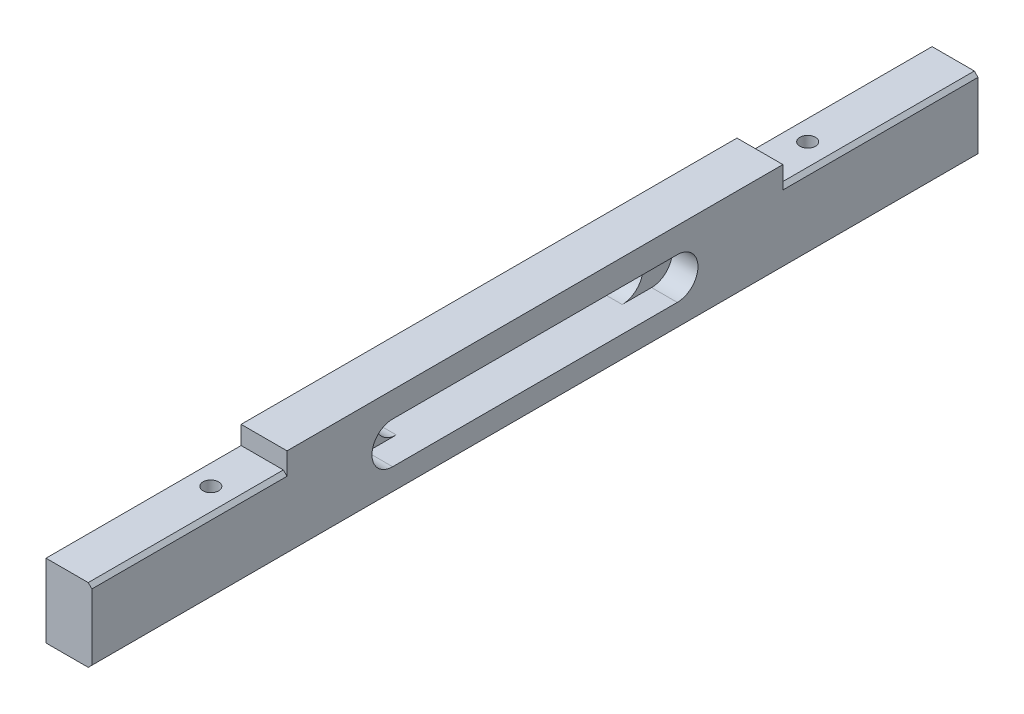
ISO-10303-21;
HEADER;
FILE_DESCRIPTION(('STEP AP214'),'2;1');
FILE_NAME('part.step','',(''),(''),'','','');
FILE_SCHEMA(('AUTOMOTIVE_DESIGN { 1 0 10303 214 1 1 1 1 }'));
ENDSEC;
DATA;
#1=APPLICATION_CONTEXT('core data for automotive mechanical design processes');
#2=APPLICATION_PROTOCOL_DEFINITION('international standard','automotive_design',2000,#1);
#3=PRODUCT_CONTEXT('',#1,'mechanical');
#4=PRODUCT('Part','Part','',(#3));
#5=PRODUCT_RELATED_PRODUCT_CATEGORY('part','',(#4));
#6=PRODUCT_DEFINITION_FORMATION('','',#4);
#7=PRODUCT_DEFINITION_CONTEXT('part definition',#1,'design');
#8=PRODUCT_DEFINITION('design','',#6,#7);
#9=PRODUCT_DEFINITION_SHAPE('','',#8);
#10=(LENGTH_UNIT() NAMED_UNIT(*) SI_UNIT(.MILLI.,.METRE.));
#11=(NAMED_UNIT(*) PLANE_ANGLE_UNIT() SI_UNIT($,.RADIAN.));
#12=(NAMED_UNIT(*) SI_UNIT($,.STERADIAN.) SOLID_ANGLE_UNIT());
#13=UNCERTAINTY_MEASURE_WITH_UNIT(LENGTH_MEASURE(1.E-05),#10,'distance_accuracy_value','');
#14=(GEOMETRIC_REPRESENTATION_CONTEXT(3) GLOBAL_UNCERTAINTY_ASSIGNED_CONTEXT((#13)) GLOBAL_UNIT_ASSIGNED_CONTEXT((#10,
#11,#12)) REPRESENTATION_CONTEXT('',''));
#15=CARTESIAN_POINT('',(0.,0.,0.));
#16=DIRECTION('',(0.,0.,1.));
#17=DIRECTION('',(1.,0.,0.));
#18=AXIS2_PLACEMENT_3D('',#15,#16,#17);
#19=CARTESIAN_POINT('',(-5.,0.,0.));
#20=DIRECTION('',(-1.,0.,0.));
#21=DIRECTION('',(0.,0.,1.));
#22=AXIS2_PLACEMENT_3D('',#19,#20,#21);
#23=PLANE('',#22);
#24=DIRECTION('',(0.,0.,-1.));
#25=VECTOR('',#24,1.);
#26=CARTESIAN_POINT('',(-5.,-5.,27.));
#27=LINE('',#26,#25);
#28=CARTESIAN_POINT('',(-5.,-5.,48.25));
#29=VERTEX_POINT('',#28);
#30=CARTESIAN_POINT('',(-5.,-5.,-48.25));
#31=VERTEX_POINT('',#30);
#32=EDGE_CURVE('E173',#29,#31,#27,.T.);
#33=ORIENTED_EDGE('',*,*,#32,.F.);
#34=DIRECTION('',(0.,-1.,0.));
#35=VECTOR('',#34,1.);
#36=CARTESIAN_POINT('',(-5.,3.,48.25));
#37=LINE('',#36,#35);
#38=CARTESIAN_POINT('',(-5.,3.,48.25));
#39=VERTEX_POINT('',#38);
#40=EDGE_CURVE('E186',#39,#29,#37,.T.);
#41=ORIENTED_EDGE('',*,*,#40,.F.);
#42=DIRECTION('',(0.,0.,-1.));
#43=VECTOR('',#42,1.);
#44=CARTESIAN_POINT('',(-5.,3.,48.25));
#45=LINE('',#44,#43);
#46=CARTESIAN_POINT('',(-5.,3.,27.));
#47=VERTEX_POINT('',#46);
#48=EDGE_CURVE('E194',#39,#47,#45,.T.);
#49=ORIENTED_EDGE('',*,*,#48,.T.);
#50=DIRECTION('',(0.,-1.,0.));
#51=VECTOR('',#50,1.);
#52=CARTESIAN_POINT('',(-5.,5.,27.));
#53=LINE('',#52,#51);
#54=CARTESIAN_POINT('',(-5.,5.,27.));
#55=VERTEX_POINT('',#54);
#56=EDGE_CURVE('E196',#55,#47,#53,.T.);
#57=ORIENTED_EDGE('',*,*,#56,.F.);
#58=DIRECTION('',(0.,0.,-1.));
#59=VECTOR('',#58,1.);
#60=CARTESIAN_POINT('',(-5.,5.,27.));
#61=LINE('',#60,#59);
#62=CARTESIAN_POINT('',(-5.,5.,-27.));
#63=VERTEX_POINT('',#62);
#64=EDGE_CURVE('E217',#55,#63,#61,.T.);
#65=ORIENTED_EDGE('',*,*,#64,.T.);
#66=DIRECTION('',(0.,-1.,0.));
#67=VECTOR('',#66,1.);
#68=CARTESIAN_POINT('',(-5.,5.,-27.));
#69=LINE('',#68,#67);
#70=CARTESIAN_POINT('',(-5.,3.,-27.));
#71=VERTEX_POINT('',#70);
#72=EDGE_CURVE('E286',#63,#71,#69,.T.);
#73=ORIENTED_EDGE('',*,*,#72,.T.);
#74=DIRECTION('',(0.,0.,-1.));
#75=VECTOR('',#74,1.);
#76=CARTESIAN_POINT('',(-5.,3.,-27.));
#77=LINE('',#76,#75);
#78=CARTESIAN_POINT('',(-5.,3.,-48.25));
#79=VERTEX_POINT('',#78);
#80=EDGE_CURVE('E284',#71,#79,#77,.T.);
#81=ORIENTED_EDGE('',*,*,#80,.T.);
#82=DIRECTION('',(0.,-1.,0.));
#83=VECTOR('',#82,1.);
#84=CARTESIAN_POINT('',(-5.,3.,-48.25));
#85=LINE('',#84,#83);
#86=EDGE_CURVE('E188',#79,#31,#85,.T.);
#87=ORIENTED_EDGE('',*,*,#86,.T.);
#88=EDGE_LOOP('',(#33,#41,#49,#57,#65,#73,#81,#87));
#89=FACE_BOUND('',#88,.T.);
#90=CARTESIAN_POINT('',(-5.,0.,-12.3));
#91=DIRECTION('',(1.,0.,0.));
#92=DIRECTION('',(0.,0.,-1.));
#93=AXIS2_PLACEMENT_3D('',#90,#91,#92);
#94=CIRCLE('',#93,2.25);
#95=CARTESIAN_POINT('',(-5.,-2.25,-12.3));
#96=VERTEX_POINT('',#95);
#97=CARTESIAN_POINT('',(-5.,2.25,-12.3));
#98=VERTEX_POINT('',#97);
#99=EDGE_CURVE('E345',#96,#98,#94,.T.);
#100=ORIENTED_EDGE('',*,*,#99,.T.);
#101=DIRECTION('',(0.,0.,-1.));
#102=VECTOR('',#101,1.);
#103=CARTESIAN_POINT('',(-5.,2.25,12.3));
#104=LINE('',#103,#102);
#105=CARTESIAN_POINT('',(-5.,2.25,12.3));
#106=VERTEX_POINT('',#105);
#107=EDGE_CURVE('E343',#106,#98,#104,.T.);
#108=ORIENTED_EDGE('',*,*,#107,.F.);
#109=CARTESIAN_POINT('',(-5.,0.,12.3));
#110=DIRECTION('',(1.,0.,0.));
#111=DIRECTION('',(0.,0.,-1.));
#112=AXIS2_PLACEMENT_3D('',#109,#110,#111);
#113=CIRCLE('',#112,2.25);
#114=CARTESIAN_POINT('',(-5.,-2.25,12.3));
#115=VERTEX_POINT('',#114);
#116=EDGE_CURVE('E351',#106,#115,#113,.T.);
#117=ORIENTED_EDGE('',*,*,#116,.T.);
#118=DIRECTION('',(0.,0.,-1.));
#119=VECTOR('',#118,1.);
#120=CARTESIAN_POINT('',(-5.,-2.25,12.3));
#121=LINE('',#120,#119);
#122=EDGE_CURVE('E348',#115,#96,#121,.T.);
#123=ORIENTED_EDGE('',*,*,#122,.T.);
#124=EDGE_LOOP('',(#100,#108,#117,#123));
#125=FACE_BOUND('',#124,.T.);
#126=ADVANCED_FACE('F37',(#89,#125),#23,.T.);
#127=CARTESIAN_POINT('',(-2.8,0.,-15.5));
#128=DIRECTION('',(1.,0.,0.));
#129=DIRECTION('',(0.,0.,-1.));
#130=AXIS2_PLACEMENT_3D('',#127,#128,#129);
#131=PLANE('',#130);
#132=CARTESIAN_POINT('',(-2.8,0.,-12.3));
#133=DIRECTION('',(1.,0.,0.));
#134=DIRECTION('',(0.,0.,-1.));
#135=AXIS2_PLACEMENT_3D('',#132,#133,#134);
#136=CIRCLE('',#135,2.25);
#137=CARTESIAN_POINT('',(-2.8,-2.25,-12.3));
#138=VERTEX_POINT('',#137);
#139=CARTESIAN_POINT('',(-2.8,2.25,-12.3));
#140=VERTEX_POINT('',#139);
#141=EDGE_CURVE('E233',#138,#140,#136,.T.);
#142=ORIENTED_EDGE('',*,*,#141,.F.);
#143=DIRECTION('',(0.,0.,-1.));
#144=VECTOR('',#143,1.);
#145=CARTESIAN_POINT('',(-2.8,-2.25,15.5));
#146=LINE('',#145,#144);
#147=CARTESIAN_POINT('',(-2.8,-2.24999999999999,-15.5));
#148=VERTEX_POINT('',#147);
#149=EDGE_CURVE('E372',#138,#148,#146,.T.);
#150=ORIENTED_EDGE('',*,*,#149,.T.);
#151=CARTESIAN_POINT('',(-2.8,0.,-15.5));
#152=DIRECTION('',(1.,0.,0.));
#153=DIRECTION('',(0.,0.,-1.));
#154=AXIS2_PLACEMENT_3D('',#151,#152,#153);
#155=CIRCLE('',#154,2.25);
#156=CARTESIAN_POINT('',(-2.8,2.25,-15.5));
#157=VERTEX_POINT('',#156);
#158=EDGE_CURVE('E368',#148,#157,#155,.T.);
#159=ORIENTED_EDGE('',*,*,#158,.T.);
#160=DIRECTION('',(0.,0.,-1.));
#161=VECTOR('',#160,1.);
#162=CARTESIAN_POINT('',(-2.8,2.25,15.5));
#163=LINE('',#162,#161);
#164=EDGE_CURVE('E369',#140,#157,#163,.T.);
#165=ORIENTED_EDGE('',*,*,#164,.F.);
#166=EDGE_LOOP('',(#142,#150,#159,#165));
#167=FACE_BOUND('',#166,.T.);
#168=ADVANCED_FACE('F302',(#167),#131,.T.);
#169=CARTESIAN_POINT('',(0.,0.,0.));
#170=DIRECTION('',(-1.,0.,0.));
#171=DIRECTION('',(0.,0.,1.));
#172=AXIS2_PLACEMENT_3D('',#169,#170,#171);
#173=PLANE('',#172);
#174=DIRECTION('',(0.,-1.,0.));
#175=VECTOR('',#174,1.);
#176=CARTESIAN_POINT('',(0.,3.,48.25));
#177=LINE('',#176,#175);
#178=CARTESIAN_POINT('',(0.,2.6,48.25));
#179=VERTEX_POINT('',#178);
#180=CARTESIAN_POINT('',(0.,-4.59999999999999,48.25));
#181=VERTEX_POINT('',#180);
#182=EDGE_CURVE('E212',#179,#181,#177,.T.);
#183=ORIENTED_EDGE('',*,*,#182,.T.);
#184=DIRECTION('',(0.,0.,-1.));
#185=VECTOR('',#184,1.);
#186=CARTESIAN_POINT('',(0.,-4.59999999999999,-48.25));
#187=LINE('',#186,#185);
#188=CARTESIAN_POINT('',(0.,-4.59999999999999,-48.25));
#189=VERTEX_POINT('',#188);
#190=EDGE_CURVE('E244',#181,#189,#187,.T.);
#191=ORIENTED_EDGE('',*,*,#190,.T.);
#192=DIRECTION('',(0.,-1.,0.));
#193=VECTOR('',#192,1.);
#194=CARTESIAN_POINT('',(0.,3.,-48.25));
#195=LINE('',#194,#193);
#196=CARTESIAN_POINT('',(0.,2.6,-48.25));
#197=VERTEX_POINT('',#196);
#198=EDGE_CURVE('E209',#197,#189,#195,.T.);
#199=ORIENTED_EDGE('',*,*,#198,.F.);
#200=DIRECTION('',(0.,0.,1.));
#201=VECTOR('',#200,1.);
#202=CARTESIAN_POINT('',(0.,2.6,0.));
#203=LINE('',#202,#201);
#204=CARTESIAN_POINT('',(0.,2.6,-27.));
#205=VERTEX_POINT('',#204);
#206=EDGE_CURVE('E235',#197,#205,#203,.T.);
#207=ORIENTED_EDGE('',*,*,#206,.T.);
#208=DIRECTION('',(0.,-1.,0.));
#209=VECTOR('',#208,1.);
#210=CARTESIAN_POINT('',(0.,5.,-27.));
#211=LINE('',#210,#209);
#212=CARTESIAN_POINT('',(0.,5.,-27.));
#213=VERTEX_POINT('',#212);
#214=EDGE_CURVE('E206',#213,#205,#211,.T.);
#215=ORIENTED_EDGE('',*,*,#214,.F.);
#216=DIRECTION('',(0.,0.,-1.));
#217=VECTOR('',#216,1.);
#218=CARTESIAN_POINT('',(0.,5.,27.));
#219=LINE('',#218,#217);
#220=CARTESIAN_POINT('',(0.,5.,27.));
#221=VERTEX_POINT('',#220);
#222=EDGE_CURVE('E203',#221,#213,#219,.T.);
#223=ORIENTED_EDGE('',*,*,#222,.F.);
#224=DIRECTION('',(0.,-1.,0.));
#225=VECTOR('',#224,1.);
#226=CARTESIAN_POINT('',(0.,5.,27.));
#227=LINE('',#226,#225);
#228=CARTESIAN_POINT('',(0.,2.6,27.));
#229=VERTEX_POINT('',#228);
#230=EDGE_CURVE('E215',#221,#229,#227,.T.);
#231=ORIENTED_EDGE('',*,*,#230,.T.);
#232=DIRECTION('',(0.,0.,1.));
#233=VECTOR('',#232,1.);
#234=CARTESIAN_POINT('',(0.,2.6,0.));
#235=LINE('',#234,#233);
#236=EDGE_CURVE('E242',#229,#179,#235,.T.);
#237=ORIENTED_EDGE('',*,*,#236,.T.);
#238=EDGE_LOOP('',(#183,#191,#199,#207,#215,#223,#231,#237));
#239=FACE_BOUND('',#238,.T.);
#240=DIRECTION('',(0.,0.,-1.));
#241=VECTOR('',#240,1.);
#242=CARTESIAN_POINT('',(0.,2.25,15.5));
#243=LINE('',#242,#241);
#244=CARTESIAN_POINT('',(0.,2.25,15.5));
#245=VERTEX_POINT('',#244);
#246=CARTESIAN_POINT('',(0.,2.25,-15.5));
#247=VERTEX_POINT('',#246);
#248=EDGE_CURVE('E364',#245,#247,#243,.T.);
#249=ORIENTED_EDGE('',*,*,#248,.T.);
#250=CARTESIAN_POINT('',(0.,0.,-15.5));
#251=DIRECTION('',(1.,0.,0.));
#252=DIRECTION('',(0.,0.,-1.));
#253=AXIS2_PLACEMENT_3D('',#250,#251,#252);
#254=CIRCLE('',#253,2.25);
#255=CARTESIAN_POINT('',(0.,-2.24999999999999,-15.5));
#256=VERTEX_POINT('',#255);
#257=EDGE_CURVE('E381',#256,#247,#254,.T.);
#258=ORIENTED_EDGE('',*,*,#257,.F.);
#259=DIRECTION('',(0.,0.,-1.));
#260=VECTOR('',#259,1.);
#261=CARTESIAN_POINT('',(0.,-2.25,15.5));
#262=LINE('',#261,#260);
#263=CARTESIAN_POINT('',(0.,-2.25,15.5));
#264=VERTEX_POINT('',#263);
#265=EDGE_CURVE('E384',#264,#256,#262,.T.);
#266=ORIENTED_EDGE('',*,*,#265,.F.);
#267=CARTESIAN_POINT('',(0.,0.,15.5));
#268=DIRECTION('',(1.,0.,0.));
#269=DIRECTION('',(0.,0.,-1.));
#270=AXIS2_PLACEMENT_3D('',#267,#268,#269);
#271=CIRCLE('',#270,2.25);
#272=EDGE_CURVE('E386',#245,#264,#271,.T.);
#273=ORIENTED_EDGE('',*,*,#272,.F.);
#274=EDGE_LOOP('',(#249,#258,#266,#273));
#275=FACE_BOUND('',#274,.T.);
#276=ADVANCED_FACE('F268',(#239,#275),#173,.F.);
#277=CARTESIAN_POINT('',(-5.,5.,27.));
#278=DIRECTION('',(0.,-1.,0.));
#279=DIRECTION('',(0.,0.,-1.));
#280=AXIS2_PLACEMENT_3D('',#277,#278,#279);
#281=PLANE('',#280);
#282=ORIENTED_EDGE('',*,*,#222,.T.);
#283=DIRECTION('',(1.,0.,0.));
#284=VECTOR('',#283,1.);
#285=CARTESIAN_POINT('',(-5.,5.,-27.));
#286=LINE('',#285,#284);
#287=EDGE_CURVE('E228',#63,#213,#286,.T.);
#288=ORIENTED_EDGE('',*,*,#287,.F.);
#289=ORIENTED_EDGE('',*,*,#64,.F.);
#290=DIRECTION('',(1.,0.,0.));
#291=VECTOR('',#290,1.);
#292=CARTESIAN_POINT('',(-5.,5.,27.));
#293=LINE('',#292,#291);
#294=EDGE_CURVE('E202',#55,#221,#293,.T.);
#295=ORIENTED_EDGE('',*,*,#294,.T.);
#296=EDGE_LOOP('',(#282,#288,#289,#295));
#297=FACE_BOUND('',#296,.T.);
#298=ADVANCED_FACE('F294',(#297),#281,.F.);
#299=CARTESIAN_POINT('',(-5.,5.,-27.));
#300=DIRECTION('',(0.,0.,1.));
#301=DIRECTION('',(1.,0.,0.));
#302=AXIS2_PLACEMENT_3D('',#299,#300,#301);
#303=PLANE('',#302);
#304=ORIENTED_EDGE('',*,*,#214,.T.);
#305=DIRECTION('',(0.707106781186548,-0.707106781186547,0.));
#306=VECTOR('',#305,1.);
#307=CARTESIAN_POINT('',(-3.7,6.3,-27.));
#308=LINE('',#307,#306);
#309=CARTESIAN_POINT('',(-0.399999999999998,3.,-27.));
#310=VERTEX_POINT('',#309);
#311=EDGE_CURVE('E11',#205,#310,#308,.F.);
#312=ORIENTED_EDGE('',*,*,#311,.T.);
#313=DIRECTION('',(1.,0.,0.));
#314=VECTOR('',#313,1.);
#315=CARTESIAN_POINT('',(-5.,3.,-27.));
#316=LINE('',#315,#314);
#317=EDGE_CURVE('E226',#71,#310,#316,.T.);
#318=ORIENTED_EDGE('',*,*,#317,.F.);
#319=ORIENTED_EDGE('',*,*,#72,.F.);
#320=ORIENTED_EDGE('',*,*,#287,.T.);
#321=EDGE_LOOP('',(#304,#312,#318,#319,#320));
#322=FACE_BOUND('',#321,.T.);
#323=ADVANCED_FACE('F285',(#322),#303,.F.);
#324=CARTESIAN_POINT('',(-5.,3.,-27.));
#325=DIRECTION('',(0.,-1.,0.));
#326=DIRECTION('',(0.,0.,-1.));
#327=AXIS2_PLACEMENT_3D('',#324,#325,#326);
#328=PLANE('',#327);
#329=CARTESIAN_POINT('',(-2.79999999999998,3.,-32.5));
#330=DIRECTION('',(0.,-1.,0.));
#331=DIRECTION('',(0.,0.,-1.));
#332=AXIS2_PLACEMENT_3D('',#329,#330,#331);
#333=CIRCLE('',#332,0.850000000000014);
#334=CARTESIAN_POINT('',(-2.79999999999998,3.,-33.35));
#335=VERTEX_POINT('',#334);
#336=EDGE_CURVE('E181',#335,#335,#333,.T.);
#337=ORIENTED_EDGE('',*,*,#336,.T.);
#338=EDGE_LOOP('',(#337));
#339=FACE_BOUND('',#338,.T.);
#340=ORIENTED_EDGE('',*,*,#317,.T.);
#341=DIRECTION('',(0.,0.,-1.));
#342=VECTOR('',#341,1.);
#343=CARTESIAN_POINT('',(-0.399999999999998,3.,-27.));
#344=LINE('',#343,#342);
#345=CARTESIAN_POINT('',(-0.399999999999998,3.,-48.25));
#346=VERTEX_POINT('',#345);
#347=EDGE_CURVE('E258',#310,#346,#344,.T.);
#348=ORIENTED_EDGE('',*,*,#347,.T.);
#349=DIRECTION('',(1.,0.,0.));
#350=VECTOR('',#349,1.);
#351=CARTESIAN_POINT('',(-5.,3.,-48.25));
#352=LINE('',#351,#350);
#353=EDGE_CURVE('E223',#79,#346,#352,.T.);
#354=ORIENTED_EDGE('',*,*,#353,.F.);
#355=ORIENTED_EDGE('',*,*,#80,.F.);
#356=EDGE_LOOP('',(#340,#348,#354,#355));
#357=FACE_BOUND('',#356,.T.);
#358=ADVANCED_FACE('F282',(#339,#357),#328,.F.);
#359=CARTESIAN_POINT('',(-5.,3.,-48.25));
#360=DIRECTION('',(0.,0.,1.));
#361=DIRECTION('',(1.,0.,0.));
#362=AXIS2_PLACEMENT_3D('',#359,#360,#361);
#363=PLANE('',#362);
#364=ORIENTED_EDGE('',*,*,#198,.T.);
#365=DIRECTION('',(-0.70710678118656,-0.707106781186535,0.));
#366=VECTOR('',#365,1.);
#367=CARTESIAN_POINT('',(0.,-4.59999999999999,-48.25));
#368=LINE('',#367,#366);
#369=CARTESIAN_POINT('',(-0.400000000000025,-5.,-48.25));
#370=VERTEX_POINT('',#369);
#371=EDGE_CURVE('E249',#189,#370,#368,.T.);
#372=ORIENTED_EDGE('',*,*,#371,.T.);
#373=DIRECTION('',(1.,0.,0.));
#374=VECTOR('',#373,1.);
#375=CARTESIAN_POINT('',(-5.,-5.,-48.25));
#376=LINE('',#375,#374);
#377=EDGE_CURVE('E180',#31,#370,#376,.T.);
#378=ORIENTED_EDGE('',*,*,#377,.F.);
#379=ORIENTED_EDGE('',*,*,#86,.F.);
#380=ORIENTED_EDGE('',*,*,#353,.T.);
#381=DIRECTION('',(-0.707106781186548,0.707106781186547,0.));
#382=VECTOR('',#381,1.);
#383=CARTESIAN_POINT('',(-0.399999999999998,3.,-48.25));
#384=LINE('',#383,#382);
#385=EDGE_CURVE('E247',#346,#197,#384,.F.);
#386=ORIENTED_EDGE('',*,*,#385,.T.);
#387=EDGE_LOOP('',(#364,#372,#378,#379,#380,#386));
#388=FACE_BOUND('',#387,.T.);
#389=ADVANCED_FACE('F277',(#388),#363,.F.);
#390=CARTESIAN_POINT('',(-5.,-5.,27.));
#391=DIRECTION('',(0.,-1.,0.));
#392=DIRECTION('',(0.,0.,-1.));
#393=AXIS2_PLACEMENT_3D('',#390,#391,#392);
#394=PLANE('',#393);
#395=CARTESIAN_POINT('',(-2.79999999999998,-5.,32.5));
#396=DIRECTION('',(0.,-1.,0.));
#397=DIRECTION('',(0.,0.,-1.));
#398=AXIS2_PLACEMENT_3D('',#395,#396,#397);
#399=CIRCLE('',#398,0.850000000000015);
#400=CARTESIAN_POINT('',(-2.79999999999998,-5.,31.65));
#401=VERTEX_POINT('',#400);
#402=EDGE_CURVE('E239',#401,#401,#399,.T.);
#403=ORIENTED_EDGE('',*,*,#402,.F.);
#404=EDGE_LOOP('',(#403));
#405=FACE_BOUND('',#404,.T.);
#406=CARTESIAN_POINT('',(-2.79999999999998,-5.,-32.5));
#407=DIRECTION('',(0.,-1.,0.));
#408=DIRECTION('',(0.,0.,-1.));
#409=AXIS2_PLACEMENT_3D('',#406,#407,#408);
#410=CIRCLE('',#409,0.850000000000014);
#411=CARTESIAN_POINT('',(-2.79999999999998,-5.,-33.35));
#412=VERTEX_POINT('',#411);
#413=EDGE_CURVE('E339',#412,#412,#410,.T.);
#414=ORIENTED_EDGE('',*,*,#413,.F.);
#415=EDGE_LOOP('',(#414));
#416=FACE_BOUND('',#415,.T.);
#417=ORIENTED_EDGE('',*,*,#377,.T.);
#418=DIRECTION('',(0.,0.,1.));
#419=VECTOR('',#418,1.);
#420=CARTESIAN_POINT('',(-0.400000000000025,-5.,48.25));
#421=LINE('',#420,#419);
#422=CARTESIAN_POINT('',(-0.400000000000025,-5.,48.25));
#423=VERTEX_POINT('',#422);
#424=EDGE_CURVE('E176',#370,#423,#421,.T.);
#425=ORIENTED_EDGE('',*,*,#424,.T.);
#426=DIRECTION('',(-1.,0.,0.));
#427=VECTOR('',#426,1.);
#428=CARTESIAN_POINT('',(0.,-5.,48.25));
#429=LINE('',#428,#427);
#430=EDGE_CURVE('E169',#423,#29,#429,.T.);
#431=ORIENTED_EDGE('',*,*,#430,.T.);
#432=ORIENTED_EDGE('',*,*,#32,.T.);
#433=EDGE_LOOP('',(#417,#425,#431,#432));
#434=FACE_BOUND('',#433,.T.);
#435=ADVANCED_FACE('F172',(#405,#416,#434),#394,.T.);
#436=CARTESIAN_POINT('',(-5.,3.,48.25));
#437=DIRECTION('',(0.,0.,1.));
#438=DIRECTION('',(0.,-1.,0.));
#439=AXIS2_PLACEMENT_3D('',#436,#437,#438);
#440=PLANE('',#439);
#441=ORIENTED_EDGE('',*,*,#430,.F.);
#442=DIRECTION('',(0.70710678118656,0.707106781186535,0.));
#443=VECTOR('',#442,1.);
#444=CARTESIAN_POINT('',(1.29999999999991,-3.30000000000013,48.25));
#445=LINE('',#444,#443);
#446=EDGE_CURVE('E254',#423,#181,#445,.T.);
#447=ORIENTED_EDGE('',*,*,#446,.T.);
#448=ORIENTED_EDGE('',*,*,#182,.F.);
#449=DIRECTION('',(0.707106781186548,-0.707106781186547,0.));
#450=VECTOR('',#449,1.);
#451=CARTESIAN_POINT('',(-2.7,5.3,48.25));
#452=LINE('',#451,#450);
#453=CARTESIAN_POINT('',(-0.399999999999998,3.,48.25));
#454=VERTEX_POINT('',#453);
#455=EDGE_CURVE('E252',#179,#454,#452,.F.);
#456=ORIENTED_EDGE('',*,*,#455,.T.);
#457=DIRECTION('',(1.,0.,0.));
#458=VECTOR('',#457,1.);
#459=CARTESIAN_POINT('',(-5.,3.,48.25));
#460=LINE('',#459,#458);
#461=EDGE_CURVE('E192',#39,#454,#460,.T.);
#462=ORIENTED_EDGE('',*,*,#461,.F.);
#463=ORIENTED_EDGE('',*,*,#40,.T.);
#464=EDGE_LOOP('',(#441,#447,#448,#456,#462,#463));
#465=FACE_BOUND('',#464,.T.);
#466=ADVANCED_FACE('F190',(#465),#440,.T.);
#467=CARTESIAN_POINT('',(-5.,3.,48.25));
#468=DIRECTION('',(0.,-1.,0.));
#469=DIRECTION('',(0.,0.,-1.));
#470=AXIS2_PLACEMENT_3D('',#467,#468,#469);
#471=PLANE('',#470);
#472=CARTESIAN_POINT('',(-2.79999999999998,3.,32.5));
#473=DIRECTION('',(0.,-1.,0.));
#474=DIRECTION('',(0.,0.,-1.));
#475=AXIS2_PLACEMENT_3D('',#472,#473,#474);
#476=CIRCLE('',#475,0.850000000000015);
#477=CARTESIAN_POINT('',(-2.79999999999998,3.,31.65));
#478=VERTEX_POINT('',#477);
#479=EDGE_CURVE('E236',#478,#478,#476,.T.);
#480=ORIENTED_EDGE('',*,*,#479,.T.);
#481=EDGE_LOOP('',(#480));
#482=FACE_BOUND('',#481,.T.);
#483=ORIENTED_EDGE('',*,*,#461,.T.);
#484=DIRECTION('',(0.,0.,-1.));
#485=VECTOR('',#484,1.);
#486=CARTESIAN_POINT('',(-0.399999999999998,3.,48.25));
#487=LINE('',#486,#485);
#488=CARTESIAN_POINT('',(-0.399999999999998,3.,27.));
#489=VERTEX_POINT('',#488);
#490=EDGE_CURVE('E256',#454,#489,#487,.T.);
#491=ORIENTED_EDGE('',*,*,#490,.T.);
#492=DIRECTION('',(1.,0.,0.));
#493=VECTOR('',#492,1.);
#494=CARTESIAN_POINT('',(-5.,3.,27.));
#495=LINE('',#494,#493);
#496=EDGE_CURVE('E219',#47,#489,#495,.T.);
#497=ORIENTED_EDGE('',*,*,#496,.F.);
#498=ORIENTED_EDGE('',*,*,#48,.F.);
#499=EDGE_LOOP('',(#483,#491,#497,#498));
#500=FACE_BOUND('',#499,.T.);
#501=ADVANCED_FACE('F319',(#482,#500),#471,.F.);
#502=CARTESIAN_POINT('',(-5.,5.,27.));
#503=DIRECTION('',(0.,0.,1.));
#504=DIRECTION('',(1.,0.,0.));
#505=AXIS2_PLACEMENT_3D('',#502,#503,#504);
#506=PLANE('',#505);
#507=ORIENTED_EDGE('',*,*,#230,.F.);
#508=ORIENTED_EDGE('',*,*,#294,.F.);
#509=ORIENTED_EDGE('',*,*,#56,.T.);
#510=ORIENTED_EDGE('',*,*,#496,.T.);
#511=DIRECTION('',(-0.707106781186548,0.707106781186547,0.));
#512=VECTOR('',#511,1.);
#513=CARTESIAN_POINT('',(-0.399999999999997,3.,27.));
#514=LINE('',#513,#512);
#515=EDGE_CURVE('E46',#489,#229,#514,.F.);
#516=ORIENTED_EDGE('',*,*,#515,.T.);
#517=EDGE_LOOP('',(#507,#508,#509,#510,#516));
#518=FACE_BOUND('',#517,.T.);
#519=ADVANCED_FACE('F262',(#518),#506,.T.);
#520=CARTESIAN_POINT('',(-2.8,2.25,15.5));
#521=DIRECTION('',(0.,-1.,0.));
#522=DIRECTION('',(0.,0.,-1.));
#523=AXIS2_PLACEMENT_3D('',#520,#521,#522);
#524=PLANE('',#523);
#525=DIRECTION('',(1.,0.,0.));
#526=VECTOR('',#525,1.);
#527=CARTESIAN_POINT('',(-2.8,2.25,-15.5));
#528=LINE('',#527,#526);
#529=EDGE_CURVE('E207',#157,#247,#528,.T.);
#530=ORIENTED_EDGE('',*,*,#529,.T.);
#531=ORIENTED_EDGE('',*,*,#248,.F.);
#532=DIRECTION('',(1.,0.,0.));
#533=VECTOR('',#532,1.);
#534=CARTESIAN_POINT('',(-2.8,2.25,15.5));
#535=LINE('',#534,#533);
#536=CARTESIAN_POINT('',(-2.8,2.25,15.5));
#537=VERTEX_POINT('',#536);
#538=EDGE_CURVE('E379',#537,#245,#535,.T.);
#539=ORIENTED_EDGE('',*,*,#538,.F.);
#540=CARTESIAN_POINT('',(-2.8,2.25,12.3));
#541=VERTEX_POINT('',#540);
#542=EDGE_CURVE('E365',#537,#541,#163,.T.);
#543=ORIENTED_EDGE('',*,*,#542,.T.);
#544=DIRECTION('',(1.,0.,0.));
#545=VECTOR('',#544,1.);
#546=CARTESIAN_POINT('',(-5.,2.25,12.3));
#547=LINE('',#546,#545);
#548=EDGE_CURVE('E354',#106,#541,#547,.T.);
#549=ORIENTED_EDGE('',*,*,#548,.F.);
#550=ORIENTED_EDGE('',*,*,#107,.T.);
#551=DIRECTION('',(1.,0.,0.));
#552=VECTOR('',#551,1.);
#553=CARTESIAN_POINT('',(-5.,2.25,-12.3));
#554=LINE('',#553,#552);
#555=EDGE_CURVE('E361',#98,#140,#554,.T.);
#556=ORIENTED_EDGE('',*,*,#555,.T.);
#557=ORIENTED_EDGE('',*,*,#164,.T.);
#558=EDGE_LOOP('',(#530,#531,#539,#543,#549,#550,#556,#557));
#559=FACE_BOUND('',#558,.T.);
#560=ADVANCED_FACE('F314',(#559),#524,.T.);
#561=CARTESIAN_POINT('',(-2.8,0.,-15.5));
#562=DIRECTION('',(1.,0.,0.));
#563=DIRECTION('',(0.,0.,-1.));
#564=AXIS2_PLACEMENT_3D('',#561,#562,#563);
#565=CYLINDRICAL_SURFACE('',#564,2.25);
#566=ORIENTED_EDGE('',*,*,#257,.T.);
#567=ORIENTED_EDGE('',*,*,#529,.F.);
#568=ORIENTED_EDGE('',*,*,#158,.F.);
#569=DIRECTION('',(1.,0.,0.));
#570=VECTOR('',#569,1.);
#571=CARTESIAN_POINT('',(-2.8,-2.24999999999999,-15.5));
#572=LINE('',#571,#570);
#573=EDGE_CURVE('E393',#148,#256,#572,.T.);
#574=ORIENTED_EDGE('',*,*,#573,.T.);
#575=EDGE_LOOP('',(#566,#567,#568,#574));
#576=FACE_BOUND('',#575,.T.);
#577=ADVANCED_FACE('F404',(#576),#565,.F.);
#578=CARTESIAN_POINT('',(-2.8,-2.25,15.5));
#579=DIRECTION('',(0.,-1.,0.));
#580=DIRECTION('',(0.,0.,-1.));
#581=AXIS2_PLACEMENT_3D('',#578,#579,#580);
#582=PLANE('',#581);
#583=ORIENTED_EDGE('',*,*,#149,.F.);
#584=DIRECTION('',(1.,0.,0.));
#585=VECTOR('',#584,1.);
#586=CARTESIAN_POINT('',(-5.,-2.25,-12.3));
#587=LINE('',#586,#585);
#588=EDGE_CURVE('E359',#96,#138,#587,.T.);
#589=ORIENTED_EDGE('',*,*,#588,.F.);
#590=ORIENTED_EDGE('',*,*,#122,.F.);
#591=DIRECTION('',(1.,0.,0.));
#592=VECTOR('',#591,1.);
#593=CARTESIAN_POINT('',(-5.,-2.25,12.3));
#594=LINE('',#593,#592);
#595=CARTESIAN_POINT('',(-2.8,-2.25,12.3));
#596=VERTEX_POINT('',#595);
#597=EDGE_CURVE('E356',#115,#596,#594,.T.);
#598=ORIENTED_EDGE('',*,*,#597,.T.);
#599=CARTESIAN_POINT('',(-2.8,-2.25,15.5));
#600=VERTEX_POINT('',#599);
#601=EDGE_CURVE('E373',#600,#596,#146,.T.);
#602=ORIENTED_EDGE('',*,*,#601,.F.);
#603=DIRECTION('',(1.,0.,0.));
#604=VECTOR('',#603,1.);
#605=CARTESIAN_POINT('',(-2.8,-2.25,15.5));
#606=LINE('',#605,#604);
#607=EDGE_CURVE('E391',#600,#264,#606,.T.);
#608=ORIENTED_EDGE('',*,*,#607,.T.);
#609=ORIENTED_EDGE('',*,*,#265,.T.);
#610=ORIENTED_EDGE('',*,*,#573,.F.);
#611=EDGE_LOOP('',(#583,#589,#590,#598,#602,#608,#609,#610));
#612=FACE_BOUND('',#611,.T.);
#613=ADVANCED_FACE('F421',(#612),#582,.F.);
#614=CARTESIAN_POINT('',(-2.8,0.,15.5));
#615=DIRECTION('',(1.,0.,0.));
#616=DIRECTION('',(0.,0.,-1.));
#617=AXIS2_PLACEMENT_3D('',#614,#615,#616);
#618=CYLINDRICAL_SURFACE('',#617,2.25);
#619=ORIENTED_EDGE('',*,*,#272,.T.);
#620=ORIENTED_EDGE('',*,*,#607,.F.);
#621=CARTESIAN_POINT('',(-2.8,0.,15.5));
#622=DIRECTION('',(1.,0.,0.));
#623=DIRECTION('',(0.,0.,-1.));
#624=AXIS2_PLACEMENT_3D('',#621,#622,#623);
#625=CIRCLE('',#624,2.25);
#626=EDGE_CURVE('E376',#537,#600,#625,.T.);
#627=ORIENTED_EDGE('',*,*,#626,.F.);
#628=ORIENTED_EDGE('',*,*,#538,.T.);
#629=EDGE_LOOP('',(#619,#620,#627,#628));
#630=FACE_BOUND('',#629,.T.);
#631=ADVANCED_FACE('F409',(#630),#618,.F.);
#632=CARTESIAN_POINT('',(-2.8,0.,12.3));
#633=DIRECTION('',(1.,0.,0.));
#634=DIRECTION('',(0.,0.,-1.));
#635=AXIS2_PLACEMENT_3D('',#632,#633,#634);
#636=CIRCLE('',#635,2.25);
#637=EDGE_CURVE('E231',#541,#596,#636,.T.);
#638=ORIENTED_EDGE('',*,*,#637,.F.);
#639=ORIENTED_EDGE('',*,*,#542,.F.);
#640=ORIENTED_EDGE('',*,*,#626,.T.);
#641=ORIENTED_EDGE('',*,*,#601,.T.);
#642=EDGE_LOOP('',(#638,#639,#640,#641));
#643=FACE_BOUND('',#642,.T.);
#644=ADVANCED_FACE('F312',(#643),#131,.T.);
#645=CARTESIAN_POINT('',(-5.,0.,-12.3));
#646=DIRECTION('',(1.,0.,0.));
#647=DIRECTION('',(0.,0.,-1.));
#648=AXIS2_PLACEMENT_3D('',#645,#646,#647);
#649=CYLINDRICAL_SURFACE('',#648,2.25);
#650=ORIENTED_EDGE('',*,*,#141,.T.);
#651=ORIENTED_EDGE('',*,*,#555,.F.);
#652=ORIENTED_EDGE('',*,*,#99,.F.);
#653=ORIENTED_EDGE('',*,*,#588,.T.);
#654=EDGE_LOOP('',(#650,#651,#652,#653));
#655=FACE_BOUND('',#654,.T.);
#656=ADVANCED_FACE('F426',(#655),#649,.F.);
#657=CARTESIAN_POINT('',(-5.,0.,12.3));
#658=DIRECTION('',(1.,0.,0.));
#659=DIRECTION('',(0.,0.,-1.));
#660=AXIS2_PLACEMENT_3D('',#657,#658,#659);
#661=CYLINDRICAL_SURFACE('',#660,2.25);
#662=ORIENTED_EDGE('',*,*,#637,.T.);
#663=ORIENTED_EDGE('',*,*,#597,.F.);
#664=ORIENTED_EDGE('',*,*,#116,.F.);
#665=ORIENTED_EDGE('',*,*,#548,.T.);
#666=EDGE_LOOP('',(#662,#663,#664,#665));
#667=FACE_BOUND('',#666,.T.);
#668=ADVANCED_FACE('F417',(#667),#661,.F.);
#669=CARTESIAN_POINT('',(-2.79999999999998,5.,32.5));
#670=DIRECTION('',(0.,-1.,0.));
#671=DIRECTION('',(0.,0.,-1.));
#672=AXIS2_PLACEMENT_3D('',#669,#670,#671);
#673=CYLINDRICAL_SURFACE('',#672,0.850000000000015);
#674=ORIENTED_EDGE('',*,*,#402,.T.);
#675=EDGE_LOOP('',(#674));
#676=FACE_BOUND('',#675,.T.);
#677=ORIENTED_EDGE('',*,*,#479,.F.);
#678=EDGE_LOOP('',(#677));
#679=FACE_BOUND('',#678,.T.);
#680=ADVANCED_FACE('F434',(#676,#679),#673,.F.);
#681=CARTESIAN_POINT('',(-2.79999999999998,5.,-32.5));
#682=DIRECTION('',(0.,-1.,0.));
#683=DIRECTION('',(0.,0.,-1.));
#684=AXIS2_PLACEMENT_3D('',#681,#682,#683);
#685=CYLINDRICAL_SURFACE('',#684,0.850000000000014);
#686=ORIENTED_EDGE('',*,*,#413,.T.);
#687=EDGE_LOOP('',(#686));
#688=FACE_BOUND('',#687,.T.);
#689=ORIENTED_EDGE('',*,*,#336,.F.);
#690=EDGE_LOOP('',(#689));
#691=FACE_BOUND('',#690,.T.);
#692=ADVANCED_FACE('F495',(#688,#691),#685,.F.);
#693=CARTESIAN_POINT('',(0.,-4.59999999999999,0.));
#694=DIRECTION('',(0.707106781186535,-0.70710678118656,0.));
#695=DIRECTION('',(0.,0.,1.));
#696=AXIS2_PLACEMENT_3D('',#693,#694,#695);
#697=PLANE('',#696);
#698=ORIENTED_EDGE('',*,*,#446,.F.);
#699=ORIENTED_EDGE('',*,*,#424,.F.);
#700=ORIENTED_EDGE('',*,*,#371,.F.);
#701=ORIENTED_EDGE('',*,*,#190,.F.);
#702=EDGE_LOOP('',(#698,#699,#700,#701));
#703=FACE_BOUND('',#702,.T.);
#704=ADVANCED_FACE('F273',(#703),#697,.T.);
#705=CARTESIAN_POINT('',(-0.399999999999998,3.,48.25));
#706=DIRECTION('',(-0.707106781186547,-0.707106781186548,0.));
#707=DIRECTION('',(0.,0.,-1.));
#708=AXIS2_PLACEMENT_3D('',#705,#706,#707);
#709=PLANE('',#708);
#710=ORIENTED_EDGE('',*,*,#455,.F.);
#711=ORIENTED_EDGE('',*,*,#236,.F.);
#712=ORIENTED_EDGE('',*,*,#515,.F.);
#713=ORIENTED_EDGE('',*,*,#490,.F.);
#714=EDGE_LOOP('',(#710,#711,#712,#713));
#715=FACE_BOUND('',#714,.T.);
#716=ADVANCED_FACE('F265',(#715),#709,.F.);
#717=CARTESIAN_POINT('',(-0.399999999999998,3.,-27.));
#718=DIRECTION('',(-0.707106781186547,-0.707106781186548,0.));
#719=DIRECTION('',(0.,0.,-1.));
#720=AXIS2_PLACEMENT_3D('',#717,#718,#719);
#721=PLANE('',#720);
#722=ORIENTED_EDGE('',*,*,#311,.F.);
#723=ORIENTED_EDGE('',*,*,#206,.F.);
#724=ORIENTED_EDGE('',*,*,#385,.F.);
#725=ORIENTED_EDGE('',*,*,#347,.F.);
#726=EDGE_LOOP('',(#722,#723,#724,#725));
#727=FACE_BOUND('',#726,.T.);
#728=ADVANCED_FACE('F40',(#727),#721,.F.);
#729=CLOSED_SHELL('',(#126,#168,#276,#298,#323,#358,#389,#435,#466,#501,#519,#560,#577,#613,
#631,#644,#656,#668,#680,#692,#704,#716,#728));
#730=MANIFOLD_SOLID_BREP('B2',#729);
#731=ADVANCED_BREP_SHAPE_REPRESENTATION('',(#18,#730),#14);
#732=SHAPE_DEFINITION_REPRESENTATION(#9,#731);
ENDSEC;
END-ISO-10303-21;
